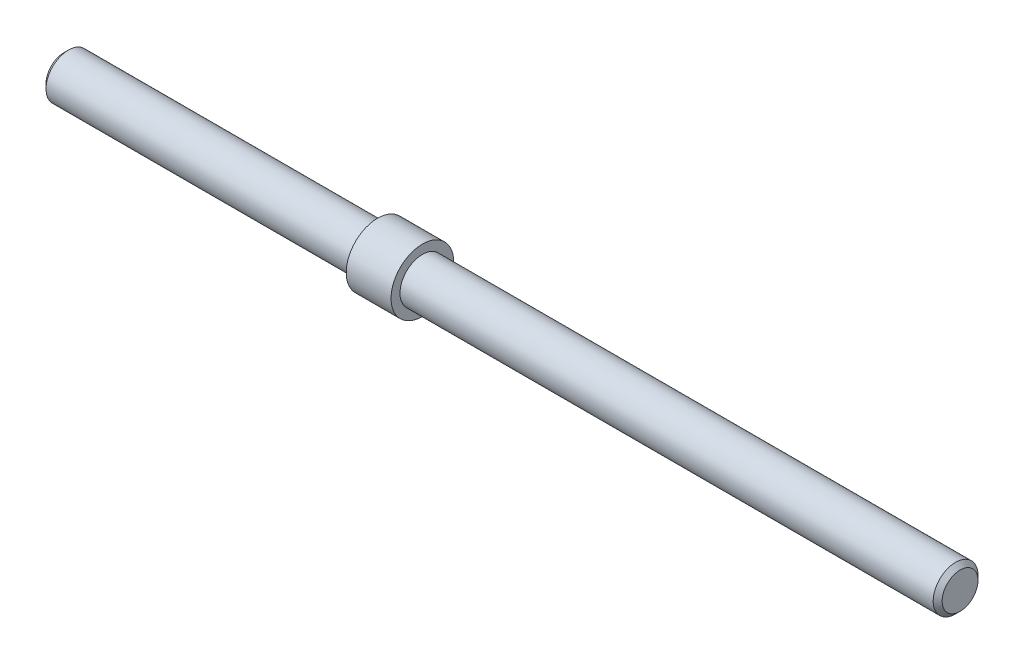
ISO-10303-21;
HEADER;
FILE_DESCRIPTION(('STEP AP214'),'2;1');
FILE_NAME('part.step','',(''),(''),'','','');
FILE_SCHEMA(('AUTOMOTIVE_DESIGN { 1 0 10303 214 1 1 1 1 }'));
ENDSEC;
DATA;
#1=APPLICATION_CONTEXT('core data for automotive mechanical design processes');
#2=APPLICATION_PROTOCOL_DEFINITION('international standard','automotive_design',2000,#1);
#3=PRODUCT_CONTEXT('',#1,'mechanical');
#4=PRODUCT('Part','Part','',(#3));
#5=PRODUCT_RELATED_PRODUCT_CATEGORY('part','',(#4));
#6=PRODUCT_DEFINITION_FORMATION('','',#4);
#7=PRODUCT_DEFINITION_CONTEXT('part definition',#1,'design');
#8=PRODUCT_DEFINITION('design','',#6,#7);
#9=PRODUCT_DEFINITION_SHAPE('','',#8);
#10=(LENGTH_UNIT() NAMED_UNIT(*) SI_UNIT(.MILLI.,.METRE.));
#11=(NAMED_UNIT(*) PLANE_ANGLE_UNIT() SI_UNIT($,.RADIAN.));
#12=(NAMED_UNIT(*) SI_UNIT($,.STERADIAN.) SOLID_ANGLE_UNIT());
#13=UNCERTAINTY_MEASURE_WITH_UNIT(LENGTH_MEASURE(1.E-05),#10,'distance_accuracy_value','');
#14=(GEOMETRIC_REPRESENTATION_CONTEXT(3) GLOBAL_UNCERTAINTY_ASSIGNED_CONTEXT((#13)) GLOBAL_UNIT_ASSIGNED_CONTEXT((#10,
#11,#12)) REPRESENTATION_CONTEXT('',''));
#15=CARTESIAN_POINT('',(0.,0.,0.));
#16=DIRECTION('',(0.,0.,1.));
#17=DIRECTION('',(1.,0.,0.));
#18=AXIS2_PLACEMENT_3D('',#15,#16,#17);
#19=CARTESIAN_POINT('',(200.,0.,0.));
#20=DIRECTION('',(-1.,0.,0.));
#21=DIRECTION('',(0.,0.,1.));
#22=AXIS2_PLACEMENT_3D('',#19,#20,#21);
#23=CYLINDRICAL_SURFACE('',#22,5.);
#24=CARTESIAN_POINT('',(80.,0.,0.));
#25=DIRECTION('',(1.,0.,0.));
#26=DIRECTION('',(0.,0.,-1.));
#27=AXIS2_PLACEMENT_3D('',#24,#25,#26);
#28=CIRCLE('',#27,5.);
#29=CARTESIAN_POINT('',(80.,0.,-5.));
#30=VERTEX_POINT('',#29);
#31=EDGE_CURVE('E38',#30,#30,#28,.T.);
#32=ORIENTED_EDGE('',*,*,#31,.T.);
#33=EDGE_LOOP('',(#32));
#34=FACE_BOUND('',#33,.T.);
#35=CARTESIAN_POINT('',(199.,0.,0.));
#36=DIRECTION('',(1.,0.,0.));
#37=DIRECTION('',(0.,0.,-1.));
#38=AXIS2_PLACEMENT_3D('',#35,#36,#37);
#39=CIRCLE('',#38,5.);
#40=CARTESIAN_POINT('',(199.,0.,-5.));
#41=VERTEX_POINT('',#40);
#42=EDGE_CURVE('E46',#41,#41,#39,.F.);
#43=ORIENTED_EDGE('',*,*,#42,.T.);
#44=EDGE_LOOP('',(#43));
#45=FACE_BOUND('',#44,.T.);
#46=ADVANCED_FACE('F33',(#34,#45),#23,.T.);
#47=CARTESIAN_POINT('',(200.,0.,0.));
#48=DIRECTION('',(1.,0.,0.));
#49=DIRECTION('',(0.,0.,-1.));
#50=AXIS2_PLACEMENT_3D('',#47,#48,#49);
#51=PLANE('',#50);
#52=CARTESIAN_POINT('',(200.,0.,0.));
#53=DIRECTION('',(1.,0.,0.));
#54=DIRECTION('',(0.,0.,-1.));
#55=AXIS2_PLACEMENT_3D('',#52,#53,#54);
#56=CIRCLE('',#55,4.);
#57=CARTESIAN_POINT('',(200.,0.,-4.));
#58=VERTEX_POINT('',#57);
#59=EDGE_CURVE('E54',#58,#58,#56,.T.);
#60=ORIENTED_EDGE('',*,*,#59,.T.);
#61=EDGE_LOOP('',(#60));
#62=FACE_BOUND('',#61,.T.);
#63=ADVANCED_FACE('F84',(#62),#51,.T.);
#64=CARTESIAN_POINT('',(200.,0.,0.));
#65=DIRECTION('',(-1.,0.,0.));
#66=DIRECTION('',(0.,0.,1.));
#67=AXIS2_PLACEMENT_3D('',#64,#65,#66);
#68=CONICAL_SURFACE('',#67,4.,0.78539816339746);
#69=ORIENTED_EDGE('',*,*,#42,.F.);
#70=EDGE_LOOP('',(#69));
#71=FACE_BOUND('',#70,.T.);
#72=ORIENTED_EDGE('',*,*,#59,.F.);
#73=EDGE_LOOP('',(#72));
#74=FACE_BOUND('',#73,.T.);
#75=ADVANCED_FACE('F80',(#71,#74),#68,.T.);
#76=CARTESIAN_POINT('',(80.,0.,0.));
#77=DIRECTION('',(-1.,0.,0.));
#78=DIRECTION('',(0.,0.,1.));
#79=AXIS2_PLACEMENT_3D('',#76,#77,#78);
#80=CYLINDRICAL_SURFACE('',#79,7.);
#81=CARTESIAN_POINT('',(80.,0.,0.));
#82=DIRECTION('',(1.,0.,0.));
#83=DIRECTION('',(0.,0.,-1.));
#84=AXIS2_PLACEMENT_3D('',#81,#82,#83);
#85=CIRCLE('',#84,7.);
#86=CARTESIAN_POINT('',(80.,0.,-7.));
#87=VERTEX_POINT('',#86);
#88=EDGE_CURVE('E60',#87,#87,#85,.T.);
#89=ORIENTED_EDGE('',*,*,#88,.F.);
#90=EDGE_LOOP('',(#89));
#91=FACE_BOUND('',#90,.T.);
#92=CARTESIAN_POINT('',(70.,0.,0.));
#93=DIRECTION('',(1.,0.,0.));
#94=DIRECTION('',(0.,0.,-1.));
#95=AXIS2_PLACEMENT_3D('',#92,#93,#94);
#96=CIRCLE('',#95,7.);
#97=CARTESIAN_POINT('',(70.,0.,-7.));
#98=VERTEX_POINT('',#97);
#99=EDGE_CURVE('E57',#98,#98,#96,.T.);
#100=ORIENTED_EDGE('',*,*,#99,.T.);
#101=EDGE_LOOP('',(#100));
#102=FACE_BOUND('',#101,.T.);
#103=ADVANCED_FACE('F72',(#91,#102),#80,.T.);
#104=CARTESIAN_POINT('',(80.,0.,0.));
#105=DIRECTION('',(1.,0.,0.));
#106=DIRECTION('',(0.,0.,-1.));
#107=AXIS2_PLACEMENT_3D('',#104,#105,#106);
#108=PLANE('',#107);
#109=ORIENTED_EDGE('',*,*,#31,.F.);
#110=EDGE_LOOP('',(#109));
#111=FACE_BOUND('',#110,.T.);
#112=ORIENTED_EDGE('',*,*,#88,.T.);
#113=EDGE_LOOP('',(#112));
#114=FACE_BOUND('',#113,.T.);
#115=ADVANCED_FACE('F69',(#111,#114),#108,.T.);
#116=CARTESIAN_POINT('',(70.,0.,0.));
#117=DIRECTION('',(1.,0.,0.));
#118=DIRECTION('',(0.,0.,-1.));
#119=AXIS2_PLACEMENT_3D('',#116,#117,#118);
#120=PLANE('',#119);
#121=CARTESIAN_POINT('',(70.,0.,0.));
#122=DIRECTION('',(1.,0.,0.));
#123=DIRECTION('',(0.,0.,-1.));
#124=AXIS2_PLACEMENT_3D('',#121,#122,#123);
#125=CIRCLE('',#124,5.);
#126=CARTESIAN_POINT('',(70.,0.,-5.));
#127=VERTEX_POINT('',#126);
#128=EDGE_CURVE('E10',#127,#127,#125,.T.);
#129=ORIENTED_EDGE('',*,*,#128,.T.);
#130=EDGE_LOOP('',(#129));
#131=FACE_BOUND('',#130,.T.);
#132=ORIENTED_EDGE('',*,*,#99,.F.);
#133=EDGE_LOOP('',(#132));
#134=FACE_BOUND('',#133,.T.);
#135=ADVANCED_FACE('F71',(#131,#134),#120,.F.);
#136=CARTESIAN_POINT('',(0.,0.,0.));
#137=DIRECTION('',(1.,0.,0.));
#138=DIRECTION('',(0.,0.,-1.));
#139=AXIS2_PLACEMENT_3D('',#136,#137,#138);
#140=PLANE('',#139);
#141=CARTESIAN_POINT('',(0.,0.,0.));
#142=DIRECTION('',(1.,0.,0.));
#143=DIRECTION('',(0.,0.,-1.));
#144=AXIS2_PLACEMENT_3D('',#141,#142,#143);
#145=CIRCLE('',#144,4.00000000000003);
#146=CARTESIAN_POINT('',(0.,0.,-4.00000000000003));
#147=VERTEX_POINT('',#146);
#148=EDGE_CURVE('E42',#147,#147,#145,.F.);
#149=ORIENTED_EDGE('',*,*,#148,.T.);
#150=EDGE_LOOP('',(#149));
#151=FACE_BOUND('',#150,.T.);
#152=ADVANCED_FACE('F78',(#151),#140,.F.);
#153=CARTESIAN_POINT('',(0.999999999999945,0.,0.));
#154=DIRECTION('',(1.,0.,0.));
#155=DIRECTION('',(0.,0.,-1.));
#156=AXIS2_PLACEMENT_3D('',#153,#154,#155);
#157=CONICAL_SURFACE('',#156,5.,0.78539816339746);
#158=ORIENTED_EDGE('',*,*,#148,.F.);
#159=EDGE_LOOP('',(#158));
#160=FACE_BOUND('',#159,.T.);
#161=CARTESIAN_POINT('',(0.999999999999945,0.,0.));
#162=DIRECTION('',(1.,0.,0.));
#163=DIRECTION('',(0.,0.,-1.));
#164=AXIS2_PLACEMENT_3D('',#161,#162,#163);
#165=CIRCLE('',#164,5.);
#166=CARTESIAN_POINT('',(0.999999999999945,0.,-5.));
#167=VERTEX_POINT('',#166);
#168=EDGE_CURVE('E51',#167,#167,#165,.T.);
#169=ORIENTED_EDGE('',*,*,#168,.F.);
#170=EDGE_LOOP('',(#169));
#171=FACE_BOUND('',#170,.T.);
#172=ADVANCED_FACE('F36',(#160,#171),#157,.T.);
#173=ORIENTED_EDGE('',*,*,#168,.T.);
#174=EDGE_LOOP('',(#173));
#175=FACE_BOUND('',#174,.T.);
#176=ORIENTED_EDGE('',*,*,#128,.F.);
#177=EDGE_LOOP('',(#176));
#178=FACE_BOUND('',#177,.T.);
#179=ADVANCED_FACE('F86',(#175,#178),#23,.T.);
#180=CLOSED_SHELL('',(#46,#63,#75,#103,#115,#135,#152,#172,#179));
#181=MANIFOLD_SOLID_BREP('B2',#180);
#182=ADVANCED_BREP_SHAPE_REPRESENTATION('',(#18,#181),#14);
#183=SHAPE_DEFINITION_REPRESENTATION(#9,#182);
ENDSEC;
END-ISO-10303-21;
